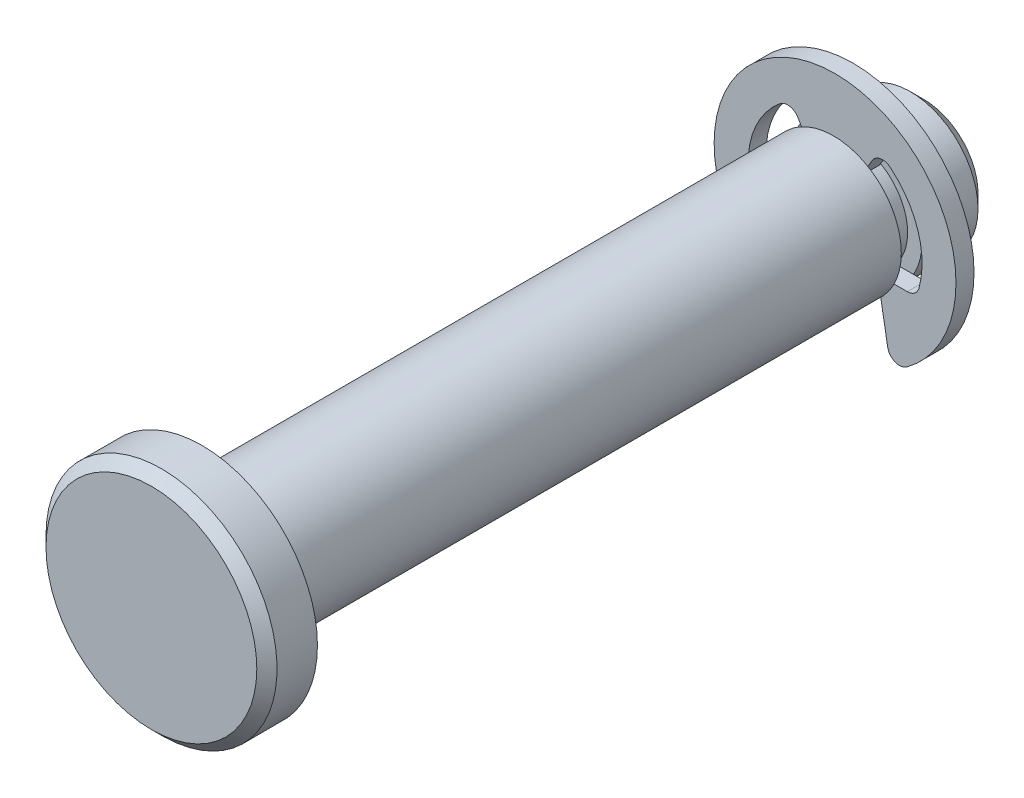
ISO-10303-21;
HEADER;
FILE_DESCRIPTION(('STEP AP214'),'2;1');
FILE_NAME('part.step','',(''),(''),'','','');
FILE_SCHEMA(('AUTOMOTIVE_DESIGN { 1 0 10303 214 1 1 1 1 }'));
ENDSEC;
DATA;
#1=APPLICATION_CONTEXT('core data for automotive mechanical design processes');
#2=APPLICATION_PROTOCOL_DEFINITION('international standard','automotive_design',2000,#1);
#3=PRODUCT_CONTEXT('',#1,'mechanical');
#4=PRODUCT('Part','Part','',(#3));
#5=PRODUCT_RELATED_PRODUCT_CATEGORY('part','',(#4));
#6=PRODUCT_DEFINITION_FORMATION('','',#4);
#7=PRODUCT_DEFINITION_CONTEXT('part definition',#1,'design');
#8=PRODUCT_DEFINITION('design','',#6,#7);
#9=PRODUCT_DEFINITION_SHAPE('','',#8);
#10=(LENGTH_UNIT() NAMED_UNIT(*) SI_UNIT(.MILLI.,.METRE.));
#11=(NAMED_UNIT(*) PLANE_ANGLE_UNIT() SI_UNIT($,.RADIAN.));
#12=(NAMED_UNIT(*) SI_UNIT($,.STERADIAN.) SOLID_ANGLE_UNIT());
#13=UNCERTAINTY_MEASURE_WITH_UNIT(LENGTH_MEASURE(1.E-05),#10,'distance_accuracy_value','');
#14=(GEOMETRIC_REPRESENTATION_CONTEXT(3) GLOBAL_UNCERTAINTY_ASSIGNED_CONTEXT((#13)) GLOBAL_UNIT_ASSIGNED_CONTEXT((#10,
#11,#12)) REPRESENTATION_CONTEXT('',''));
#15=CARTESIAN_POINT('',(0.,0.,0.));
#16=DIRECTION('',(0.,0.,1.));
#17=DIRECTION('',(1.,0.,0.));
#18=AXIS2_PLACEMENT_3D('',#15,#16,#17);
#19=CARTESIAN_POINT('',(0.,0.,-9.5758));
#20=DIRECTION('',(0.,0.,1.));
#21=DIRECTION('',(1.,0.,0.));
#22=AXIS2_PLACEMENT_3D('',#19,#20,#21);
#23=PLANE('',#22);
#24=DIRECTION('',(-0.173648177666931,0.984807753012208,0.));
#25=VECTOR('',#24,1.);
#26=CARTESIAN_POINT('',(1.25692963982568,0.22163060835344,-9.5758));
#27=LINE('',#26,#25);
#28=CARTESIAN_POINT('',(1.85256069501915,-3.15636096616503,-9.5758));
#29=VERTEX_POINT('',#28);
#30=CARTESIAN_POINT('',(1.49352,-1.12014,-9.5758));
#31=VERTEX_POINT('',#30);
#32=EDGE_CURVE('E203',#29,#31,#27,.T.);
#33=ORIENTED_EDGE('',*,*,#32,.F.);
#34=CARTESIAN_POINT('',(2.2715471535382,-3.08248234897663,-9.5758));
#35=DIRECTION('',(0.,0.,1.));
#36=DIRECTION('',(1.,0.,0.));
#37=AXIS2_PLACEMENT_3D('',#34,#35,#36);
#38=CIRCLE('',#37,0.42545);
#39=CARTESIAN_POINT('',(2.52394128170911,-3.42498038775182,-9.5758));
#40=VERTEX_POINT('',#39);
#41=EDGE_CURVE('E257',#29,#40,#38,.T.);
#42=ORIENTED_EDGE('',*,*,#41,.T.);
#43=CARTESIAN_POINT('',(0.,0.,-9.5758));
#44=DIRECTION('',(0.,0.,1.));
#45=DIRECTION('',(1.,0.,0.));
#46=AXIS2_PLACEMENT_3D('',#43,#44,#45);
#47=CIRCLE('',#46,4.2545);
#48=CARTESIAN_POINT('',(-2.52394128170911,-3.42498038775182,-9.5758));
#49=VERTEX_POINT('',#48);
#50=EDGE_CURVE('E183',#40,#49,#47,.T.);
#51=ORIENTED_EDGE('',*,*,#50,.T.);
#52=CARTESIAN_POINT('',(-2.2715471535382,-3.08248234897663,-9.5758));
#53=DIRECTION('',(0.,0.,1.));
#54=DIRECTION('',(1.,0.,0.));
#55=AXIS2_PLACEMENT_3D('',#52,#53,#54);
#56=CIRCLE('',#55,0.42545);
#57=CARTESIAN_POINT('',(-1.85256069501915,-3.15636096616503,-9.5758));
#58=VERTEX_POINT('',#57);
#59=EDGE_CURVE('E255',#49,#58,#56,.T.);
#60=ORIENTED_EDGE('',*,*,#59,.T.);
#61=DIRECTION('',(-0.173648177666931,-0.984807753012208,0.));
#62=VECTOR('',#61,1.);
#63=CARTESIAN_POINT('',(-1.25692963982568,0.22163060835344,-9.5758));
#64=LINE('',#63,#62);
#65=CARTESIAN_POINT('',(-1.49352,-1.12014,-9.5758));
#66=VERTEX_POINT('',#65);
#67=EDGE_CURVE('E199',#66,#58,#64,.T.);
#68=ORIENTED_EDGE('',*,*,#67,.F.);
#69=DIRECTION('',(1.,0.,0.));
#70=VECTOR('',#69,1.);
#71=CARTESIAN_POINT('',(0.,-1.12014,-9.5758));
#72=LINE('',#71,#70);
#73=CARTESIAN_POINT('',(-2.54203626378539,-1.12014,-9.5758));
#74=VERTEX_POINT('',#73);
#75=EDGE_CURVE('E190',#74,#66,#72,.T.);
#76=ORIENTED_EDGE('',*,*,#75,.F.);
#77=CARTESIAN_POINT('',(-2.54203626378539,-0.69469,-9.5758));
#78=DIRECTION('',(0.,0.,1.));
#79=DIRECTION('',(1.,0.,0.));
#80=AXIS2_PLACEMENT_3D('',#77,#78,#79);
#81=CIRCLE('',#80,0.42545);
#82=CARTESIAN_POINT('',(-2.95243729914352,-0.806844771084337,-9.5758));
#83=VERTEX_POINT('',#82);
#84=EDGE_CURVE('E55',#74,#83,#81,.F.);
#85=ORIENTED_EDGE('',*,*,#84,.T.);
#86=CARTESIAN_POINT('',(0.,0.,-9.5758));
#87=DIRECTION('',(0.,0.,1.));
#88=DIRECTION('',(1.,0.,0.));
#89=AXIS2_PLACEMENT_3D('',#86,#87,#88);
#90=CIRCLE('',#89,3.0607);
#91=CARTESIAN_POINT('',(-1.93820951958955,2.36880314677528,-9.5758));
#92=VERTEX_POINT('',#91);
#93=EDGE_CURVE('E215',#92,#83,#90,.T.);
#94=ORIENTED_EDGE('',*,*,#93,.F.);
#95=CARTESIAN_POINT('',(-1.66879035400345,2.03952968031481,-9.5758));
#96=DIRECTION('',(0.,0.,1.));
#97=DIRECTION('',(1.,0.,0.));
#98=AXIS2_PLACEMENT_3D('',#95,#96,#97);
#99=CIRCLE('',#98,0.42545);
#100=CARTESIAN_POINT('',(-1.30033984596336,2.25225468031482,-9.5758));
#101=VERTEX_POINT('',#100);
#102=EDGE_CURVE('E187',#92,#101,#99,.F.);
#103=ORIENTED_EDGE('',*,*,#102,.T.);
#104=DIRECTION('',(-0.500000000000002,0.866025403784438,0.));
#105=VECTOR('',#104,1.);
#106=CARTESIAN_POINT('',(0.,0.,-9.5758));
#107=LINE('',#106,#105);
#108=CARTESIAN_POINT('',(-0.933450000000003,1.61678282632517,-9.5758));
#109=VERTEX_POINT('',#108);
#110=EDGE_CURVE('E179',#109,#101,#107,.T.);
#111=ORIENTED_EDGE('',*,*,#110,.F.);
#112=DIRECTION('',(1.,0.,0.));
#113=VECTOR('',#112,1.);
#114=CARTESIAN_POINT('',(-0.933450000000003,1.61678282632517,-9.5758));
#115=LINE('',#114,#113);
#116=CARTESIAN_POINT('',(0.933450000000003,1.61678282632517,-9.5758));
#117=VERTEX_POINT('',#116);
#118=EDGE_CURVE('E163',#109,#117,#115,.T.);
#119=ORIENTED_EDGE('',*,*,#118,.T.);
#120=DIRECTION('',(-0.500000000000002,-0.866025403784438,0.));
#121=VECTOR('',#120,1.);
#122=CARTESIAN_POINT('',(0.,0.,-9.5758));
#123=LINE('',#122,#121);
#124=CARTESIAN_POINT('',(1.30033984596336,2.25225468031482,-9.5758));
#125=VERTEX_POINT('',#124);
#126=EDGE_CURVE('E213',#125,#117,#123,.T.);
#127=ORIENTED_EDGE('',*,*,#126,.F.);
#128=CARTESIAN_POINT('',(1.66879035400345,2.03952968031482,-9.5758));
#129=DIRECTION('',(0.,0.,1.));
#130=DIRECTION('',(1.,0.,0.));
#131=AXIS2_PLACEMENT_3D('',#128,#129,#130);
#132=CIRCLE('',#131,0.42545);
#133=CARTESIAN_POINT('',(1.93820951958955,2.36880314677528,-9.5758));
#134=VERTEX_POINT('',#133);
#135=EDGE_CURVE('E272',#125,#134,#132,.F.);
#136=ORIENTED_EDGE('',*,*,#135,.T.);
#137=CARTESIAN_POINT('',(0.,0.,-9.5758));
#138=DIRECTION('',(0.,0.,1.));
#139=DIRECTION('',(1.,0.,0.));
#140=AXIS2_PLACEMENT_3D('',#137,#138,#139);
#141=CIRCLE('',#140,3.0607);
#142=CARTESIAN_POINT('',(2.95243729914352,-0.806844771084337,-9.5758));
#143=VERTEX_POINT('',#142);
#144=EDGE_CURVE('E218',#143,#134,#141,.T.);
#145=ORIENTED_EDGE('',*,*,#144,.F.);
#146=CARTESIAN_POINT('',(2.54203626378539,-0.69469,-9.5758));
#147=DIRECTION('',(0.,0.,1.));
#148=DIRECTION('',(1.,0.,0.));
#149=AXIS2_PLACEMENT_3D('',#146,#147,#148);
#150=CIRCLE('',#149,0.42545);
#151=CARTESIAN_POINT('',(2.54203626378539,-1.12014,-9.5758));
#152=VERTEX_POINT('',#151);
#153=EDGE_CURVE('E268',#143,#152,#150,.F.);
#154=ORIENTED_EDGE('',*,*,#153,.T.);
#155=DIRECTION('',(1.,0.,0.));
#156=VECTOR('',#155,1.);
#157=CARTESIAN_POINT('',(0.,-1.12014,-9.5758));
#158=LINE('',#157,#156);
#159=EDGE_CURVE('E208',#31,#152,#158,.T.);
#160=ORIENTED_EDGE('',*,*,#159,.F.);
#161=EDGE_LOOP('',(#33,#42,#51,#60,#68,#76,#85,#94,#103,#111,#119,#127,#136,#145,#154,#160));
#162=FACE_BOUND('',#161,.T.);
#163=ADVANCED_FACE('F47',(#162),#23,.T.);
#164=CARTESIAN_POINT('',(0.,0.,-10.2108));
#165=DIRECTION('',(0.,0.,1.));
#166=DIRECTION('',(1.,0.,0.));
#167=AXIS2_PLACEMENT_3D('',#164,#165,#166);
#168=PLANE('',#167);
#169=CARTESIAN_POINT('',(0.,0.,-10.2108));
#170=DIRECTION('',(0.,0.,1.));
#171=DIRECTION('',(1.,0.,0.));
#172=AXIS2_PLACEMENT_3D('',#169,#170,#171);
#173=CIRCLE('',#172,4.2545);
#174=CARTESIAN_POINT('',(2.52394128170911,-3.42498038775182,-10.2108));
#175=VERTEX_POINT('',#174);
#176=CARTESIAN_POINT('',(-2.52394128170911,-3.42498038775182,-10.2108));
#177=VERTEX_POINT('',#176);
#178=EDGE_CURVE('E221',#175,#177,#173,.T.);
#179=ORIENTED_EDGE('',*,*,#178,.F.);
#180=CARTESIAN_POINT('',(2.2715471535382,-3.08248234897663,-10.2108));
#181=DIRECTION('',(0.,0.,1.));
#182=DIRECTION('',(1.,0.,0.));
#183=AXIS2_PLACEMENT_3D('',#180,#181,#182);
#184=CIRCLE('',#183,0.42545);
#185=CARTESIAN_POINT('',(1.85256069501915,-3.15636096616503,-10.2108));
#186=VERTEX_POINT('',#185);
#187=EDGE_CURVE('E265',#175,#186,#184,.F.);
#188=ORIENTED_EDGE('',*,*,#187,.T.);
#189=DIRECTION('',(-0.173648177666931,0.984807753012208,0.));
#190=VECTOR('',#189,1.);
#191=CARTESIAN_POINT('',(1.25692963982568,0.22163060835344,-10.2108));
#192=LINE('',#191,#190);
#193=CARTESIAN_POINT('',(1.49352,-1.12014,-10.2108));
#194=VERTEX_POINT('',#193);
#195=EDGE_CURVE('E201',#186,#194,#192,.T.);
#196=ORIENTED_EDGE('',*,*,#195,.T.);
#197=DIRECTION('',(1.,0.,0.));
#198=VECTOR('',#197,1.);
#199=CARTESIAN_POINT('',(0.,-1.12014,-10.2108));
#200=LINE('',#199,#198);
#201=CARTESIAN_POINT('',(2.54203626378539,-1.12014,-10.2108));
#202=VERTEX_POINT('',#201);
#203=EDGE_CURVE('E205',#194,#202,#200,.T.);
#204=ORIENTED_EDGE('',*,*,#203,.T.);
#205=CARTESIAN_POINT('',(2.54203626378539,-0.69469,-10.2108));
#206=DIRECTION('',(0.,0.,1.));
#207=DIRECTION('',(1.,0.,0.));
#208=AXIS2_PLACEMENT_3D('',#205,#206,#207);
#209=CIRCLE('',#208,0.42545);
#210=CARTESIAN_POINT('',(2.95243729914352,-0.806844771084337,-10.2108));
#211=VERTEX_POINT('',#210);
#212=EDGE_CURVE('E270',#202,#211,#209,.T.);
#213=ORIENTED_EDGE('',*,*,#212,.T.);
#214=CARTESIAN_POINT('',(0.,0.,-10.2108));
#215=DIRECTION('',(0.,0.,1.));
#216=DIRECTION('',(1.,0.,0.));
#217=AXIS2_PLACEMENT_3D('',#214,#215,#216);
#218=CIRCLE('',#217,3.0607);
#219=CARTESIAN_POINT('',(1.93820951958955,2.36880314677528,-10.2108));
#220=VERTEX_POINT('',#219);
#221=EDGE_CURVE('E229',#211,#220,#218,.T.);
#222=ORIENTED_EDGE('',*,*,#221,.T.);
#223=CARTESIAN_POINT('',(1.66879035400345,2.03952968031482,-10.2108));
#224=DIRECTION('',(0.,0.,1.));
#225=DIRECTION('',(1.,0.,0.));
#226=AXIS2_PLACEMENT_3D('',#223,#224,#225);
#227=CIRCLE('',#226,0.42545);
#228=CARTESIAN_POINT('',(1.30033984596336,2.25225468031482,-10.2108));
#229=VERTEX_POINT('',#228);
#230=EDGE_CURVE('E274',#220,#229,#227,.T.);
#231=ORIENTED_EDGE('',*,*,#230,.T.);
#232=DIRECTION('',(-0.500000000000002,-0.866025403784438,0.));
#233=VECTOR('',#232,1.);
#234=CARTESIAN_POINT('',(0.,0.,-10.2108));
#235=LINE('',#234,#233);
#236=CARTESIAN_POINT('',(0.933450000000003,1.61678282632517,-10.2108));
#237=VERTEX_POINT('',#236);
#238=EDGE_CURVE('E211',#229,#237,#235,.T.);
#239=ORIENTED_EDGE('',*,*,#238,.T.);
#240=DIRECTION('',(-1.,0.,0.));
#241=VECTOR('',#240,1.);
#242=CARTESIAN_POINT('',(-0.933450000000003,1.61678282632517,-10.2108));
#243=LINE('',#242,#241);
#244=CARTESIAN_POINT('',(-0.933450000000003,1.61678282632517,-10.2108));
#245=VERTEX_POINT('',#244);
#246=EDGE_CURVE('E174',#237,#245,#243,.T.);
#247=ORIENTED_EDGE('',*,*,#246,.T.);
#248=DIRECTION('',(-0.500000000000002,0.866025403784438,0.));
#249=VECTOR('',#248,1.);
#250=CARTESIAN_POINT('',(0.,0.,-10.2108));
#251=LINE('',#250,#249);
#252=CARTESIAN_POINT('',(-1.30033984596336,2.25225468031482,-10.2108));
#253=VERTEX_POINT('',#252);
#254=EDGE_CURVE('E182',#245,#253,#251,.T.);
#255=ORIENTED_EDGE('',*,*,#254,.T.);
#256=CARTESIAN_POINT('',(-1.66879035400345,2.03952968031481,-10.2108));
#257=DIRECTION('',(0.,0.,1.));
#258=DIRECTION('',(1.,0.,0.));
#259=AXIS2_PLACEMENT_3D('',#256,#257,#258);
#260=CIRCLE('',#259,0.42545);
#261=CARTESIAN_POINT('',(-1.93820951958955,2.36880314677528,-10.2108));
#262=VERTEX_POINT('',#261);
#263=EDGE_CURVE('E277',#253,#262,#260,.T.);
#264=ORIENTED_EDGE('',*,*,#263,.T.);
#265=CARTESIAN_POINT('',(0.,0.,-10.2108));
#266=DIRECTION('',(0.,0.,1.));
#267=DIRECTION('',(1.,0.,0.));
#268=AXIS2_PLACEMENT_3D('',#265,#266,#267);
#269=CIRCLE('',#268,3.0607);
#270=CARTESIAN_POINT('',(-2.95243729914352,-0.806844771084337,-10.2108));
#271=VERTEX_POINT('',#270);
#272=EDGE_CURVE('E226',#262,#271,#269,.T.);
#273=ORIENTED_EDGE('',*,*,#272,.T.);
#274=CARTESIAN_POINT('',(-2.54203626378539,-0.69469,-10.2108));
#275=DIRECTION('',(0.,0.,1.));
#276=DIRECTION('',(1.,0.,0.));
#277=AXIS2_PLACEMENT_3D('',#274,#275,#276);
#278=CIRCLE('',#277,0.42545);
#279=CARTESIAN_POINT('',(-2.54203626378539,-1.12014,-10.2108));
#280=VERTEX_POINT('',#279);
#281=EDGE_CURVE('E12',#271,#280,#278,.T.);
#282=ORIENTED_EDGE('',*,*,#281,.T.);
#283=DIRECTION('',(1.,0.,0.));
#284=VECTOR('',#283,1.);
#285=CARTESIAN_POINT('',(0.,-1.12014,-10.2108));
#286=LINE('',#285,#284);
#287=CARTESIAN_POINT('',(-1.49352,-1.12014,-10.2108));
#288=VERTEX_POINT('',#287);
#289=EDGE_CURVE('E188',#280,#288,#286,.T.);
#290=ORIENTED_EDGE('',*,*,#289,.T.);
#291=DIRECTION('',(-0.173648177666931,-0.984807753012208,0.));
#292=VECTOR('',#291,1.);
#293=CARTESIAN_POINT('',(-1.25692963982568,0.22163060835344,-10.2108));
#294=LINE('',#293,#292);
#295=CARTESIAN_POINT('',(-1.85256069501915,-3.15636096616503,-10.2108));
#296=VERTEX_POINT('',#295);
#297=EDGE_CURVE('E197',#288,#296,#294,.T.);
#298=ORIENTED_EDGE('',*,*,#297,.T.);
#299=CARTESIAN_POINT('',(-2.2715471535382,-3.08248234897663,-10.2108));
#300=DIRECTION('',(0.,0.,1.));
#301=DIRECTION('',(1.,0.,0.));
#302=AXIS2_PLACEMENT_3D('',#299,#300,#301);
#303=CIRCLE('',#302,0.42545);
#304=EDGE_CURVE('E69',#296,#177,#303,.F.);
#305=ORIENTED_EDGE('',*,*,#304,.T.);
#306=EDGE_LOOP('',(#179,#188,#196,#204,#213,#222,#231,#239,#247,#255,#264,#273,#282,#290,#298,#305));
#307=FACE_BOUND('',#306,.T.);
#308=ADVANCED_FACE('F290',(#307),#168,.F.);
#309=CARTESIAN_POINT('',(0.,0.,-9.5758));
#310=DIRECTION('',(0.,0.,-1.));
#311=DIRECTION('',(-1.,0.,0.));
#312=AXIS2_PLACEMENT_3D('',#309,#310,#311);
#313=CYLINDRICAL_SURFACE('',#312,4.2545);
#314=ORIENTED_EDGE('',*,*,#50,.F.);
#315=DIRECTION('',(0.,0.,-1.));
#316=VECTOR('',#315,1.);
#317=CARTESIAN_POINT('',(2.52394128170911,-3.42498038775182,-9.5758));
#318=LINE('',#317,#316);
#319=EDGE_CURVE('E262',#40,#175,#318,.T.);
#320=ORIENTED_EDGE('',*,*,#319,.T.);
#321=ORIENTED_EDGE('',*,*,#178,.T.);
#322=DIRECTION('',(0.,0.,-1.));
#323=VECTOR('',#322,1.);
#324=CARTESIAN_POINT('',(-2.52394128170911,-3.42498038775182,-9.5758));
#325=LINE('',#324,#323);
#326=EDGE_CURVE('E259',#177,#49,#325,.F.);
#327=ORIENTED_EDGE('',*,*,#326,.T.);
#328=EDGE_LOOP('',(#314,#320,#321,#327));
#329=FACE_BOUND('',#328,.T.);
#330=ADVANCED_FACE('F330',(#329),#313,.T.);
#331=CARTESIAN_POINT('',(-1.49352,-1.12014,-12.7));
#332=DIRECTION('',(-0.984807753012208,0.173648177666931,0.));
#333=DIRECTION('',(-0.173648177666931,-0.984807753012208,0.));
#334=AXIS2_PLACEMENT_3D('',#331,#332,#333);
#335=PLANE('',#334);
#336=ORIENTED_EDGE('',*,*,#67,.T.);
#337=DIRECTION('',(0.,0.,-1.));
#338=VECTOR('',#337,1.);
#339=CARTESIAN_POINT('',(-1.85256069501915,-3.15636096616503,-12.7));
#340=LINE('',#339,#338);
#341=EDGE_CURVE('E62',#58,#296,#340,.T.);
#342=ORIENTED_EDGE('',*,*,#341,.T.);
#343=ORIENTED_EDGE('',*,*,#297,.F.);
#344=DIRECTION('',(0.,0.,1.));
#345=VECTOR('',#344,1.);
#346=CARTESIAN_POINT('',(-1.49352,-1.12014,-12.7));
#347=LINE('',#346,#345);
#348=EDGE_CURVE('E295',#288,#66,#347,.T.);
#349=ORIENTED_EDGE('',*,*,#348,.T.);
#350=EDGE_LOOP('',(#336,#342,#343,#349));
#351=FACE_BOUND('',#350,.T.);
#352=ADVANCED_FACE('F335',(#351),#335,.F.);
#353=CARTESIAN_POINT('',(-1.53035,2.65064395336303,-12.7));
#354=DIRECTION('',(0.866025403784438,0.500000000000002,0.));
#355=DIRECTION('',(-0.500000000000002,0.866025403784438,0.));
#356=AXIS2_PLACEMENT_3D('',#353,#354,#355);
#357=PLANE('',#356);
#358=ORIENTED_EDGE('',*,*,#110,.T.);
#359=DIRECTION('',(0.,0.,-1.));
#360=VECTOR('',#359,1.);
#361=CARTESIAN_POINT('',(-1.30033984596336,2.25225468031482,-10.2108));
#362=LINE('',#361,#360);
#363=EDGE_CURVE('E247',#101,#253,#362,.T.);
#364=ORIENTED_EDGE('',*,*,#363,.T.);
#365=ORIENTED_EDGE('',*,*,#254,.F.);
#366=DIRECTION('',(0.,0.,-1.));
#367=VECTOR('',#366,1.);
#368=CARTESIAN_POINT('',(-0.933450000000003,1.61678282632517,-9.5758));
#369=LINE('',#368,#367);
#370=EDGE_CURVE('E167',#245,#109,#369,.F.);
#371=ORIENTED_EDGE('',*,*,#370,.T.);
#372=EDGE_LOOP('',(#358,#364,#365,#371));
#373=FACE_BOUND('',#372,.T.);
#374=ADVANCED_FACE('F178',(#373),#357,.F.);
#375=CARTESIAN_POINT('',(0.,0.,-12.7));
#376=DIRECTION('',(0.,0.,1.));
#377=DIRECTION('',(1.,0.,0.));
#378=AXIS2_PLACEMENT_3D('',#375,#376,#377);
#379=CYLINDRICAL_SURFACE('',#378,3.0607);
#380=ORIENTED_EDGE('',*,*,#272,.F.);
#381=DIRECTION('',(0.,0.,1.));
#382=VECTOR('',#381,1.);
#383=CARTESIAN_POINT('',(-1.93820951958955,2.36880314677528,-12.7));
#384=LINE('',#383,#382);
#385=EDGE_CURVE('E244',#262,#92,#384,.T.);
#386=ORIENTED_EDGE('',*,*,#385,.T.);
#387=ORIENTED_EDGE('',*,*,#93,.T.);
#388=DIRECTION('',(0.,0.,1.));
#389=VECTOR('',#388,1.);
#390=CARTESIAN_POINT('',(-2.95243729914352,-0.806844771084337,-12.7));
#391=LINE('',#390,#389);
#392=EDGE_CURVE('E242',#83,#271,#391,.F.);
#393=ORIENTED_EDGE('',*,*,#392,.T.);
#394=EDGE_LOOP('',(#380,#386,#387,#393));
#395=FACE_BOUND('',#394,.T.);
#396=ADVANCED_FACE('F285',(#395),#379,.F.);
#397=CARTESIAN_POINT('',(-2.84836284036989,-1.12014,-12.7));
#398=DIRECTION('',(0.,-1.,0.));
#399=DIRECTION('',(0.,0.,-1.));
#400=AXIS2_PLACEMENT_3D('',#397,#398,#399);
#401=PLANE('',#400);
#402=ORIENTED_EDGE('',*,*,#289,.F.);
#403=DIRECTION('',(0.,0.,-1.));
#404=VECTOR('',#403,1.);
#405=CARTESIAN_POINT('',(-2.54203626378539,-1.12014,-9.5758));
#406=LINE('',#405,#404);
#407=EDGE_CURVE('E249',#280,#74,#406,.F.);
#408=ORIENTED_EDGE('',*,*,#407,.T.);
#409=ORIENTED_EDGE('',*,*,#75,.T.);
#410=ORIENTED_EDGE('',*,*,#348,.F.);
#411=EDGE_LOOP('',(#402,#408,#409,#410));
#412=FACE_BOUND('',#411,.T.);
#413=ADVANCED_FACE('F293',(#412),#401,.F.);
#414=CARTESIAN_POINT('',(0.,0.,-12.7));
#415=DIRECTION('',(0.,0.,1.));
#416=DIRECTION('',(1.,0.,0.));
#417=AXIS2_PLACEMENT_3D('',#414,#415,#416);
#418=CYLINDRICAL_SURFACE('',#417,3.0607);
#419=ORIENTED_EDGE('',*,*,#221,.F.);
#420=DIRECTION('',(0.,0.,1.));
#421=VECTOR('',#420,1.);
#422=CARTESIAN_POINT('',(2.95243729914352,-0.806844771084337,-12.7));
#423=LINE('',#422,#421);
#424=EDGE_CURVE('E234',#211,#143,#423,.T.);
#425=ORIENTED_EDGE('',*,*,#424,.T.);
#426=ORIENTED_EDGE('',*,*,#144,.T.);
#427=DIRECTION('',(0.,0.,1.));
#428=VECTOR('',#427,1.);
#429=CARTESIAN_POINT('',(1.93820951958955,2.36880314677528,-12.7));
#430=LINE('',#429,#428);
#431=EDGE_CURVE('E232',#134,#220,#430,.F.);
#432=ORIENTED_EDGE('',*,*,#431,.T.);
#433=EDGE_LOOP('',(#419,#425,#426,#432));
#434=FACE_BOUND('',#433,.T.);
#435=ADVANCED_FACE('F309',(#434),#418,.F.);
#436=CARTESIAN_POINT('',(1.49352,-1.12014,-12.7));
#437=DIRECTION('',(0.,-1.,0.));
#438=DIRECTION('',(0.,0.,-1.));
#439=AXIS2_PLACEMENT_3D('',#436,#437,#438);
#440=PLANE('',#439);
#441=ORIENTED_EDGE('',*,*,#159,.T.);
#442=DIRECTION('',(0.,0.,-1.));
#443=VECTOR('',#442,1.);
#444=CARTESIAN_POINT('',(2.54203626378539,-1.12014,-10.2108));
#445=LINE('',#444,#443);
#446=EDGE_CURVE('E237',#152,#202,#445,.T.);
#447=ORIENTED_EDGE('',*,*,#446,.T.);
#448=ORIENTED_EDGE('',*,*,#203,.F.);
#449=DIRECTION('',(0.,0.,1.));
#450=VECTOR('',#449,1.);
#451=CARTESIAN_POINT('',(1.49352,-1.12014,-12.7));
#452=LINE('',#451,#450);
#453=EDGE_CURVE('E192',#194,#31,#452,.T.);
#454=ORIENTED_EDGE('',*,*,#453,.T.);
#455=EDGE_LOOP('',(#441,#447,#448,#454));
#456=FACE_BOUND('',#455,.T.);
#457=ADVANCED_FACE('F319',(#456),#440,.F.);
#458=CARTESIAN_POINT('',(1.49352,-1.12014,-12.7));
#459=DIRECTION('',(0.984807753012208,0.173648177666931,0.));
#460=DIRECTION('',(-0.173648177666931,0.984807753012208,0.));
#461=AXIS2_PLACEMENT_3D('',#458,#459,#460);
#462=PLANE('',#461);
#463=ORIENTED_EDGE('',*,*,#195,.F.);
#464=DIRECTION('',(0.,0.,-1.));
#465=VECTOR('',#464,1.);
#466=CARTESIAN_POINT('',(1.85256069501915,-3.15636096616503,-12.7));
#467=LINE('',#466,#465);
#468=EDGE_CURVE('E252',#186,#29,#467,.F.);
#469=ORIENTED_EDGE('',*,*,#468,.T.);
#470=ORIENTED_EDGE('',*,*,#32,.T.);
#471=ORIENTED_EDGE('',*,*,#453,.F.);
#472=EDGE_LOOP('',(#463,#469,#470,#471));
#473=FACE_BOUND('',#472,.T.);
#474=ADVANCED_FACE('F324',(#473),#462,.F.);
#475=CARTESIAN_POINT('',(0.,0.,-12.7));
#476=DIRECTION('',(-0.866025403784438,0.500000000000002,0.));
#477=DIRECTION('',(-0.500000000000002,-0.866025403784438,0.));
#478=AXIS2_PLACEMENT_3D('',#475,#476,#477);
#479=PLANE('',#478);
#480=ORIENTED_EDGE('',*,*,#238,.F.);
#481=DIRECTION('',(0.,0.,-1.));
#482=VECTOR('',#481,1.);
#483=CARTESIAN_POINT('',(1.30033984596336,2.25225468031482,-9.5758));
#484=LINE('',#483,#482);
#485=EDGE_CURVE('E239',#229,#125,#484,.F.);
#486=ORIENTED_EDGE('',*,*,#485,.T.);
#487=ORIENTED_EDGE('',*,*,#126,.T.);
#488=DIRECTION('',(0.,0.,-1.));
#489=VECTOR('',#488,1.);
#490=CARTESIAN_POINT('',(0.933450000000003,1.61678282632517,-9.5758));
#491=LINE('',#490,#489);
#492=EDGE_CURVE('E170',#117,#237,#491,.T.);
#493=ORIENTED_EDGE('',*,*,#492,.T.);
#494=EDGE_LOOP('',(#480,#486,#487,#493));
#495=FACE_BOUND('',#494,.T.);
#496=ADVANCED_FACE('F302',(#495),#479,.F.);
#497=CARTESIAN_POINT('',(-0.933450000000003,1.61678282632517,-12.0943801577228));
#498=DIRECTION('',(0.,-1.,0.));
#499=DIRECTION('',(0.,0.,-1.));
#500=AXIS2_PLACEMENT_3D('',#497,#498,#499);
#501=PLANE('',#500);
#502=ORIENTED_EDGE('',*,*,#246,.F.);
#503=ORIENTED_EDGE('',*,*,#492,.F.);
#504=ORIENTED_EDGE('',*,*,#118,.F.);
#505=ORIENTED_EDGE('',*,*,#370,.F.);
#506=EDGE_LOOP('',(#502,#503,#504,#505));
#507=FACE_BOUND('',#506,.T.);
#508=ADVANCED_FACE('F166',(#507),#501,.T.);
#509=CARTESIAN_POINT('',(2.54203626378539,-0.69469,-12.7));
#510=DIRECTION('',(0.,0.,1.));
#511=DIRECTION('',(1.,0.,0.));
#512=AXIS2_PLACEMENT_3D('',#509,#510,#511);
#513=CYLINDRICAL_SURFACE('',#512,0.42545);
#514=ORIENTED_EDGE('',*,*,#212,.F.);
#515=ORIENTED_EDGE('',*,*,#446,.F.);
#516=ORIENTED_EDGE('',*,*,#153,.F.);
#517=ORIENTED_EDGE('',*,*,#424,.F.);
#518=EDGE_LOOP('',(#514,#515,#516,#517));
#519=FACE_BOUND('',#518,.T.);
#520=ADVANCED_FACE('F315',(#519),#513,.F.);
#521=CARTESIAN_POINT('',(1.66879035400345,2.03952968031482,-12.7));
#522=DIRECTION('',(0.,0.,1.));
#523=DIRECTION('',(1.,0.,0.));
#524=AXIS2_PLACEMENT_3D('',#521,#522,#523);
#525=CYLINDRICAL_SURFACE('',#524,0.42545);
#526=ORIENTED_EDGE('',*,*,#230,.F.);
#527=ORIENTED_EDGE('',*,*,#431,.F.);
#528=ORIENTED_EDGE('',*,*,#135,.F.);
#529=ORIENTED_EDGE('',*,*,#485,.F.);
#530=EDGE_LOOP('',(#526,#527,#528,#529));
#531=FACE_BOUND('',#530,.T.);
#532=ADVANCED_FACE('F312',(#531),#525,.F.);
#533=CARTESIAN_POINT('',(-1.66879035400345,2.03952968031481,-12.7));
#534=DIRECTION('',(0.,0.,1.));
#535=DIRECTION('',(1.,0.,0.));
#536=AXIS2_PLACEMENT_3D('',#533,#534,#535);
#537=CYLINDRICAL_SURFACE('',#536,0.42545);
#538=ORIENTED_EDGE('',*,*,#263,.F.);
#539=ORIENTED_EDGE('',*,*,#363,.F.);
#540=ORIENTED_EDGE('',*,*,#102,.F.);
#541=ORIENTED_EDGE('',*,*,#385,.F.);
#542=EDGE_LOOP('',(#538,#539,#540,#541));
#543=FACE_BOUND('',#542,.T.);
#544=ADVANCED_FACE('F358',(#543),#537,.F.);
#545=CARTESIAN_POINT('',(-2.54203626378539,-0.69469,-12.7));
#546=DIRECTION('',(0.,0.,1.));
#547=DIRECTION('',(1.,0.,0.));
#548=AXIS2_PLACEMENT_3D('',#545,#546,#547);
#549=CYLINDRICAL_SURFACE('',#548,0.42545);
#550=ORIENTED_EDGE('',*,*,#281,.F.);
#551=ORIENTED_EDGE('',*,*,#392,.F.);
#552=ORIENTED_EDGE('',*,*,#84,.F.);
#553=ORIENTED_EDGE('',*,*,#407,.F.);
#554=EDGE_LOOP('',(#550,#551,#552,#553));
#555=FACE_BOUND('',#554,.T.);
#556=ADVANCED_FACE('F288',(#555),#549,.F.);
#557=CARTESIAN_POINT('',(2.2715471535382,-3.08248234897663,-9.5758));
#558=DIRECTION('',(0.,0.,-1.));
#559=DIRECTION('',(-1.,0.,0.));
#560=AXIS2_PLACEMENT_3D('',#557,#558,#559);
#561=CYLINDRICAL_SURFACE('',#560,0.42545);
#562=ORIENTED_EDGE('',*,*,#187,.F.);
#563=ORIENTED_EDGE('',*,*,#319,.F.);
#564=ORIENTED_EDGE('',*,*,#41,.F.);
#565=ORIENTED_EDGE('',*,*,#468,.F.);
#566=EDGE_LOOP('',(#562,#563,#564,#565));
#567=FACE_BOUND('',#566,.T.);
#568=ADVANCED_FACE('F333',(#567),#561,.T.);
#569=CARTESIAN_POINT('',(-2.2715471535382,-3.08248234897663,-9.5758));
#570=DIRECTION('',(0.,0.,-1.));
#571=DIRECTION('',(-1.,0.,0.));
#572=AXIS2_PLACEMENT_3D('',#569,#570,#571);
#573=CYLINDRICAL_SURFACE('',#572,0.42545);
#574=ORIENTED_EDGE('',*,*,#304,.F.);
#575=ORIENTED_EDGE('',*,*,#341,.F.);
#576=ORIENTED_EDGE('',*,*,#59,.F.);
#577=ORIENTED_EDGE('',*,*,#326,.F.);
#578=EDGE_LOOP('',(#574,#575,#576,#577));
#579=FACE_BOUND('',#578,.T.);
#580=ADVANCED_FACE('F49',(#579),#573,.T.);
#581=CLOSED_SHELL('',(#163,#308,#330,#352,#374,#396,#413,#435,#457,#474,#496,#508,#520,#532,
#544,#556,#568,#580));
#582=MANIFOLD_SOLID_BREP('B2',#581);
#583=CARTESIAN_POINT('',(0.,0.,12.7));
#584=DIRECTION('',(0.,0.,-1.));
#585=DIRECTION('',(-1.,0.,0.));
#586=AXIS2_PLACEMENT_3D('',#583,#584,#585);
#587=CYLINDRICAL_SURFACE('',#586,2.38125);
#588=CARTESIAN_POINT('',(0.,0.,12.7));
#589=DIRECTION('',(0.,0.,1.));
#590=DIRECTION('',(1.,0.,0.));
#591=AXIS2_PLACEMENT_3D('',#588,#589,#590);
#592=CIRCLE('',#591,2.38125);
#593=CARTESIAN_POINT('',(2.38125,0.,12.7));
#594=VERTEX_POINT('',#593);
#595=EDGE_CURVE('E509',#594,#594,#592,.T.);
#596=ORIENTED_EDGE('',*,*,#595,.F.);
#597=EDGE_LOOP('',(#596));
#598=FACE_BOUND('',#597,.T.);
#599=CARTESIAN_POINT('',(0.,0.,-9.525));
#600=DIRECTION('',(0.,0.,1.));
#601=DIRECTION('',(1.,0.,0.));
#602=AXIS2_PLACEMENT_3D('',#599,#600,#601);
#603=CIRCLE('',#602,2.38125);
#604=CARTESIAN_POINT('',(2.38125,0.,-9.525));
#605=VERTEX_POINT('',#604);
#606=EDGE_CURVE('E521',#605,#605,#603,.T.);
#607=ORIENTED_EDGE('',*,*,#606,.T.);
#608=EDGE_LOOP('',(#607));
#609=FACE_BOUND('',#608,.T.);
#610=ADVANCED_FACE('F489',(#598,#609),#587,.T.);
#611=CARTESIAN_POINT('',(0.,2.38125,-9.525));
#612=DIRECTION('',(0.,0.,-1.));
#613=DIRECTION('',(-1.,0.,0.));
#614=AXIS2_PLACEMENT_3D('',#611,#612,#613);
#615=PLANE('',#614);
#616=CARTESIAN_POINT('',(0.,0.,-9.525));
#617=DIRECTION('',(0.,0.,1.));
#618=DIRECTION('',(1.,0.,0.));
#619=AXIS2_PLACEMENT_3D('',#616,#617,#618);
#620=CIRCLE('',#619,1.8669);
#621=CARTESIAN_POINT('',(1.8669,0.,-9.525));
#622=VERTEX_POINT('',#621);
#623=EDGE_CURVE('E512',#622,#622,#620,.T.);
#624=ORIENTED_EDGE('',*,*,#623,.T.);
#625=EDGE_LOOP('',(#624));
#626=FACE_BOUND('',#625,.T.);
#627=ORIENTED_EDGE('',*,*,#606,.F.);
#628=EDGE_LOOP('',(#627));
#629=FACE_BOUND('',#628,.T.);
#630=ADVANCED_FACE('F539',(#626,#629),#615,.T.);
#631=CARTESIAN_POINT('',(0.,0.,12.7));
#632=DIRECTION('',(0.,0.,1.));
#633=DIRECTION('',(1.,0.,0.));
#634=AXIS2_PLACEMENT_3D('',#631,#632,#633);
#635=CYLINDRICAL_SURFACE('',#634,1.8669);
#636=CARTESIAN_POINT('',(0.,0.,-10.2616));
#637=DIRECTION('',(0.,0.,1.));
#638=DIRECTION('',(1.,0.,0.));
#639=AXIS2_PLACEMENT_3D('',#636,#637,#638);
#640=CIRCLE('',#639,1.8669);
#641=CARTESIAN_POINT('',(1.8669,0.,-10.2616));
#642=VERTEX_POINT('',#641);
#643=EDGE_CURVE('E515',#642,#642,#640,.T.);
#644=ORIENTED_EDGE('',*,*,#643,.T.);
#645=EDGE_LOOP('',(#644));
#646=FACE_BOUND('',#645,.T.);
#647=ORIENTED_EDGE('',*,*,#623,.F.);
#648=EDGE_LOOP('',(#647));
#649=FACE_BOUND('',#648,.T.);
#650=ADVANCED_FACE('F544',(#646,#649),#635,.T.);
#651=CARTESIAN_POINT('',(0.,2.38125,-10.2616));
#652=DIRECTION('',(0.,0.,1.));
#653=DIRECTION('',(1.,0.,0.));
#654=AXIS2_PLACEMENT_3D('',#651,#652,#653);
#655=PLANE('',#654);
#656=CARTESIAN_POINT('',(0.,0.,-10.2616));
#657=DIRECTION('',(0.,0.,1.));
#658=DIRECTION('',(1.,0.,0.));
#659=AXIS2_PLACEMENT_3D('',#656,#657,#658);
#660=CIRCLE('',#659,2.38125);
#661=CARTESIAN_POINT('',(2.38125,0.,-10.2616));
#662=VERTEX_POINT('',#661);
#663=EDGE_CURVE('E518',#662,#662,#660,.T.);
#664=ORIENTED_EDGE('',*,*,#663,.T.);
#665=EDGE_LOOP('',(#664));
#666=FACE_BOUND('',#665,.T.);
#667=ORIENTED_EDGE('',*,*,#643,.F.);
#668=EDGE_LOOP('',(#667));
#669=FACE_BOUND('',#668,.T.);
#670=ADVANCED_FACE('F550',(#666,#669),#655,.T.);
#671=CARTESIAN_POINT('',(0.,0.,-12.7));
#672=DIRECTION('',(0.,0.,1.));
#673=DIRECTION('',(1.,0.,0.));
#674=AXIS2_PLACEMENT_3D('',#671,#672,#673);
#675=PLANE('',#674);
#676=CARTESIAN_POINT('',(0.,0.,-12.7));
#677=DIRECTION('',(0.,0.,1.));
#678=DIRECTION('',(1.,0.,0.));
#679=AXIS2_PLACEMENT_3D('',#676,#677,#678);
#680=CIRCLE('',#679,1.905);
#681=CARTESIAN_POINT('',(1.905,0.,-12.7));
#682=VERTEX_POINT('',#681);
#683=EDGE_CURVE('E46',#682,#682,#680,.F.);
#684=ORIENTED_EDGE('',*,*,#683,.T.);
#685=EDGE_LOOP('',(#684));
#686=FACE_BOUND('',#685,.T.);
#687=ADVANCED_FACE('F555',(#686),#675,.F.);
#688=CARTESIAN_POINT('',(0.,0.,-12.22375));
#689=DIRECTION('',(0.,0.,1.));
#690=DIRECTION('',(1.,0.,0.));
#691=AXIS2_PLACEMENT_3D('',#688,#689,#690);
#692=CIRCLE('',#691,2.38125);
#693=CARTESIAN_POINT('',(2.38125,0.,-12.22375));
#694=VERTEX_POINT('',#693);
#695=EDGE_CURVE('E496',#694,#694,#692,.T.);
#696=ORIENTED_EDGE('',*,*,#695,.T.);
#697=EDGE_LOOP('',(#696));
#698=FACE_BOUND('',#697,.T.);
#699=ORIENTED_EDGE('',*,*,#663,.F.);
#700=EDGE_LOOP('',(#699));
#701=FACE_BOUND('',#700,.T.);
#702=ADVANCED_FACE('F533',(#698,#701),#587,.T.);
#703=CARTESIAN_POINT('',(0.,0.,12.7));
#704=DIRECTION('',(0.,0.,1.));
#705=DIRECTION('',(1.,0.,0.));
#706=AXIS2_PLACEMENT_3D('',#703,#704,#705);
#707=PLANE('',#706);
#708=CARTESIAN_POINT('',(0.,0.,12.7));
#709=DIRECTION('',(0.,0.,1.));
#710=DIRECTION('',(1.,0.,0.));
#711=AXIS2_PLACEMENT_3D('',#708,#709,#710);
#712=CIRCLE('',#711,4.064);
#713=CARTESIAN_POINT('',(4.064,0.,12.7));
#714=VERTEX_POINT('',#713);
#715=EDGE_CURVE('E524',#714,#714,#712,.T.);
#716=ORIENTED_EDGE('',*,*,#715,.F.);
#717=EDGE_LOOP('',(#716));
#718=FACE_BOUND('',#717,.T.);
#719=ORIENTED_EDGE('',*,*,#595,.T.);
#720=EDGE_LOOP('',(#719));
#721=FACE_BOUND('',#720,.T.);
#722=ADVANCED_FACE('F530',(#718,#721),#707,.F.);
#723=CARTESIAN_POINT('',(0.,0.,14.478));
#724=DIRECTION('',(0.,0.,-1.));
#725=DIRECTION('',(-1.,0.,0.));
#726=AXIS2_PLACEMENT_3D('',#723,#724,#725);
#727=CYLINDRICAL_SURFACE('',#726,4.064);
#728=CARTESIAN_POINT('',(0.,0.,14.1224));
#729=DIRECTION('',(0.,0.,1.));
#730=DIRECTION('',(1.,0.,0.));
#731=AXIS2_PLACEMENT_3D('',#728,#729,#730);
#732=CIRCLE('',#731,4.064);
#733=CARTESIAN_POINT('',(-4.064,0.,14.1224));
#734=VERTEX_POINT('',#733);
#735=EDGE_CURVE('E500',#734,#734,#732,.F.);
#736=ORIENTED_EDGE('',*,*,#735,.T.);
#737=EDGE_LOOP('',(#736));
#738=FACE_BOUND('',#737,.T.);
#739=ORIENTED_EDGE('',*,*,#715,.T.);
#740=EDGE_LOOP('',(#739));
#741=FACE_BOUND('',#740,.T.);
#742=ADVANCED_FACE('F528',(#738,#741),#727,.T.);
#743=CARTESIAN_POINT('',(0.,0.,14.478));
#744=DIRECTION('',(0.,0.,1.));
#745=DIRECTION('',(1.,0.,0.));
#746=AXIS2_PLACEMENT_3D('',#743,#744,#745);
#747=PLANE('',#746);
#748=CARTESIAN_POINT('',(0.,0.,14.478));
#749=DIRECTION('',(0.,0.,1.));
#750=DIRECTION('',(1.,0.,0.));
#751=AXIS2_PLACEMENT_3D('',#748,#749,#750);
#752=CIRCLE('',#751,3.7084);
#753=CARTESIAN_POINT('',(-3.7084,0.,14.478));
#754=VERTEX_POINT('',#753);
#755=EDGE_CURVE('E504',#754,#754,#752,.T.);
#756=ORIENTED_EDGE('',*,*,#755,.T.);
#757=EDGE_LOOP('',(#756));
#758=FACE_BOUND('',#757,.T.);
#759=ADVANCED_FACE('F559',(#758),#747,.T.);
#760=CARTESIAN_POINT('',(0.,0.,14.478));
#761=DIRECTION('',(0.,0.,-1.));
#762=DIRECTION('',(-1.,0.,0.));
#763=AXIS2_PLACEMENT_3D('',#760,#761,#762);
#764=CONICAL_SURFACE('',#763,3.7084,0.785398163397446);
#765=CARTESIAN_POINT('',(-4.064,0.,14.1224));
#766=CARTESIAN_POINT('',(-4.06029583333333,0.,14.1261041666667));
#767=CARTESIAN_POINT('',(-4.05659166666667,0.,14.1298083333333));
#768=CARTESIAN_POINT('',(-4.04918333333333,0.,14.1372166666667));
#769=CARTESIAN_POINT('',(-4.04547916666667,0.,14.1409208333333));
#770=CARTESIAN_POINT('',(-4.03807083333333,0.,14.1483291666667));
#771=CARTESIAN_POINT('',(-4.03436666666667,0.,14.1520333333333));
#772=CARTESIAN_POINT('',(-4.02695833333333,0.,14.1594416666667));
#773=CARTESIAN_POINT('',(-4.02325416666667,0.,14.1631458333333));
#774=CARTESIAN_POINT('',(-4.01584583333333,0.,14.1705541666667));
#775=CARTESIAN_POINT('',(-4.01214166666667,0.,14.1742583333333));
#776=CARTESIAN_POINT('',(-4.00473333333333,0.,14.1816666666667));
#777=CARTESIAN_POINT('',(-4.00102916666667,0.,14.1853708333333));
#778=CARTESIAN_POINT('',(-3.99362083333333,0.,14.1927791666667));
#779=CARTESIAN_POINT('',(-3.98991666666667,0.,14.1964833333333));
#780=CARTESIAN_POINT('',(-3.98250833333333,0.,14.2038916666667));
#781=CARTESIAN_POINT('',(-3.97880416666667,0.,14.2075958333333));
#782=CARTESIAN_POINT('',(-3.97139583333333,0.,14.2150041666667));
#783=CARTESIAN_POINT('',(-3.96769166666667,0.,14.2187083333333));
#784=CARTESIAN_POINT('',(-3.96028333333333,0.,14.2261166666667));
#785=CARTESIAN_POINT('',(-3.95657916666667,0.,14.2298208333333));
#786=CARTESIAN_POINT('',(-3.94917083333333,0.,14.2372291666667));
#787=CARTESIAN_POINT('',(-3.94546666666667,0.,14.2409333333333));
#788=CARTESIAN_POINT('',(-3.93805833333333,0.,14.2483416666667));
#789=CARTESIAN_POINT('',(-3.93435416666667,0.,14.2520458333333));
#790=CARTESIAN_POINT('',(-3.92694583333333,0.,14.2594541666667));
#791=CARTESIAN_POINT('',(-3.92324166666667,0.,14.2631583333333));
#792=CARTESIAN_POINT('',(-3.91583333333333,0.,14.2705666666667));
#793=CARTESIAN_POINT('',(-3.91212916666667,0.,14.2742708333333));
#794=CARTESIAN_POINT('',(-3.90472083333333,0.,14.2816791666667));
#795=CARTESIAN_POINT('',(-3.90101666666667,0.,14.2853833333333));
#796=CARTESIAN_POINT('',(-3.89360833333333,0.,14.2927916666667));
#797=CARTESIAN_POINT('',(-3.88990416666667,0.,14.2964958333333));
#798=CARTESIAN_POINT('',(-3.88249583333333,0.,14.3039041666667));
#799=CARTESIAN_POINT('',(-3.87879166666667,0.,14.3076083333333));
#800=CARTESIAN_POINT('',(-3.87138333333333,0.,14.3150166666667));
#801=CARTESIAN_POINT('',(-3.86767916666667,0.,14.3187208333333));
#802=CARTESIAN_POINT('',(-3.86027083333333,0.,14.3261291666667));
#803=CARTESIAN_POINT('',(-3.85656666666667,0.,14.3298333333333));
#804=CARTESIAN_POINT('',(-3.84915833333333,0.,14.3372416666667));
#805=CARTESIAN_POINT('',(-3.84545416666667,0.,14.3409458333333));
#806=CARTESIAN_POINT('',(-3.83804583333333,0.,14.3483541666667));
#807=CARTESIAN_POINT('',(-3.83434166666667,0.,14.3520583333333));
#808=CARTESIAN_POINT('',(-3.82693333333333,0.,14.3594666666667));
#809=CARTESIAN_POINT('',(-3.82322916666667,0.,14.3631708333333));
#810=CARTESIAN_POINT('',(-3.81582083333333,0.,14.3705791666667));
#811=CARTESIAN_POINT('',(-3.81211666666667,0.,14.3742833333333));
#812=CARTESIAN_POINT('',(-3.80470833333333,0.,14.3816916666667));
#813=CARTESIAN_POINT('',(-3.80100416666667,0.,14.3853958333333));
#814=CARTESIAN_POINT('',(-3.79359583333333,0.,14.3928041666667));
#815=CARTESIAN_POINT('',(-3.78989166666667,0.,14.3965083333333));
#816=CARTESIAN_POINT('',(-3.78248333333333,0.,14.4039166666667));
#817=CARTESIAN_POINT('',(-3.77877916666667,0.,14.4076208333333));
#818=CARTESIAN_POINT('',(-3.77137083333333,0.,14.4150291666667));
#819=CARTESIAN_POINT('',(-3.76766666666667,0.,14.4187333333333));
#820=CARTESIAN_POINT('',(-3.76025833333333,0.,14.4261416666667));
#821=CARTESIAN_POINT('',(-3.75655416666667,0.,14.4298458333333));
#822=CARTESIAN_POINT('',(-3.74914583333333,0.,14.4372541666667));
#823=CARTESIAN_POINT('',(-3.74544166666667,0.,14.4409583333333));
#824=CARTESIAN_POINT('',(-3.73803333333333,0.,14.4483666666667));
#825=CARTESIAN_POINT('',(-3.73432916666667,0.,14.4520708333333));
#826=CARTESIAN_POINT('',(-3.72692083333333,0.,14.4594791666667));
#827=CARTESIAN_POINT('',(-3.72321666666666,0.,14.4631833333333));
#828=CARTESIAN_POINT('',(-3.71580833333333,0.,14.4705916666667));
#829=CARTESIAN_POINT('',(-3.71210416666666,0.,14.4742958333333));
#830=CARTESIAN_POINT('',(-3.7084,0.,14.478));
#831=B_SPLINE_CURVE_WITH_KNOTS('',3,(#765,#766,#767,#768,#769,#770,#771,#772,#773,#774,#775,
#776,#777,#778,#779,#780,#781,#782,#783,#784,#785,#786,#787,#788,#789,#790,#791,#792,#793,#794,
#795,#796,#797,#798,#799,#800,#801,#802,#803,#804,#805,#806,#807,#808,#809,#810,#811,#812,#813,
#814,#815,#816,#817,#818,#819,#820,#821,#822,#823,#824,#825,#826,#827,#828,#829,#830),
.UNSPECIFIED.,.F.,.F.,(4,2,2,2,2,2,2,2,2,2,2,2,2,2,2,2,2,2,2,2,2,2,2,2,2,2,2,2,2,2,2,2,4),(0.,
0.0157154482118703,0.0314308964237412,0.0471463446356127,0.0628617928474843,0.0785772410593552,
0.0942926892712267,0.110008137483098,0.125723585694969,0.141439033906839,0.157154482118711,
0.172869930330583,0.188585378542453,0.204300826754325,0.220016274966196,0.235731723178068,
0.251447171389939,0.267162619601809,0.28287806781368,0.298593516025552,0.314308964237423,
0.330024412449294,0.345739860661166,0.361455308873037,0.377170757084908,0.392886205296778,
0.40860165350865,0.424317101720521,0.440032549932392,0.455747998144264,0.471463446356135,
0.487178894568007,0.502894342779878),.UNSPECIFIED.);
#832=EDGE_CURVE('BSEAM557',#734,#754,#831,.T.);
#833=ORIENTED_EDGE('',*,*,#735,.F.);
#834=ORIENTED_EDGE('',*,*,#755,.F.);
#835=ORIENTED_EDGE('',*,*,#832,.T.);
#836=ORIENTED_EDGE('',*,*,#832,.F.);
#837=EDGE_LOOP('',(#833,#835,#834,#836));
#838=FACE_BOUND('',#837,.T.);
#839=ADVANCED_FACE('F557',(#838),#764,.T.);
#840=CARTESIAN_POINT('',(0.,0.,-12.22375));
#841=DIRECTION('',(0.,0.,1.));
#842=DIRECTION('',(1.,0.,0.));
#843=AXIS2_PLACEMENT_3D('',#840,#841,#842);
#844=CONICAL_SURFACE('',#843,2.38125,0.785398163397451);
#845=ORIENTED_EDGE('',*,*,#683,.F.);
#846=EDGE_LOOP('',(#845));
#847=FACE_BOUND('',#846,.T.);
#848=ORIENTED_EDGE('',*,*,#695,.F.);
#849=EDGE_LOOP('',(#848));
#850=FACE_BOUND('',#849,.T.);
#851=ADVANCED_FACE('F491',(#847,#850),#844,.T.);
#852=CLOSED_SHELL('',(#610,#630,#650,#670,#687,#702,#722,#742,#759,#839,#851));
#853=MANIFOLD_SOLID_BREP('B6',#852);
#854=ADVANCED_BREP_SHAPE_REPRESENTATION('',(#18,#582,#853),#14);
#855=SHAPE_DEFINITION_REPRESENTATION(#9,#854);
ENDSEC;
END-ISO-10303-21;
